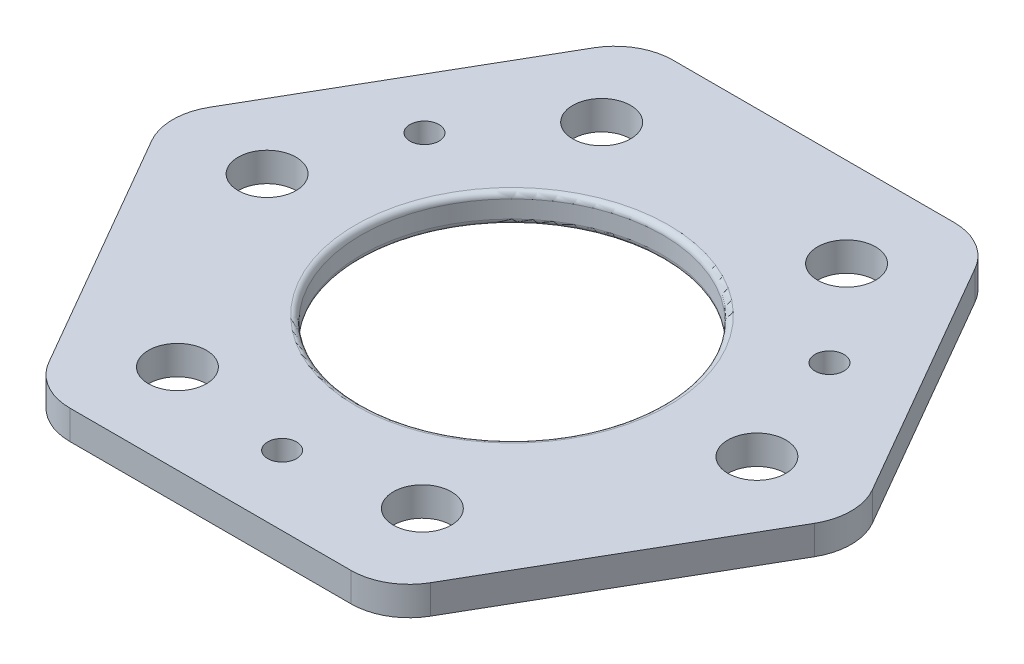
ISO-10303-21;
HEADER;
FILE_DESCRIPTION(('STEP AP214'),'2;1');
FILE_NAME('part.step','',(''),(''),'','','');
FILE_SCHEMA(('AUTOMOTIVE_DESIGN { 1 0 10303 214 1 1 1 1 }'));
ENDSEC;
DATA;
#1=APPLICATION_CONTEXT('core data for automotive mechanical design processes');
#2=APPLICATION_PROTOCOL_DEFINITION('international standard','automotive_design',2000,#1);
#3=PRODUCT_CONTEXT('',#1,'mechanical');
#4=PRODUCT('Part','Part','',(#3));
#5=PRODUCT_RELATED_PRODUCT_CATEGORY('part','',(#4));
#6=PRODUCT_DEFINITION_FORMATION('','',#4);
#7=PRODUCT_DEFINITION_CONTEXT('part definition',#1,'design');
#8=PRODUCT_DEFINITION('design','',#6,#7);
#9=PRODUCT_DEFINITION_SHAPE('','',#8);
#10=(LENGTH_UNIT() NAMED_UNIT(*) SI_UNIT(.MILLI.,.METRE.));
#11=(NAMED_UNIT(*) PLANE_ANGLE_UNIT() SI_UNIT($,.RADIAN.));
#12=(NAMED_UNIT(*) SI_UNIT($,.STERADIAN.) SOLID_ANGLE_UNIT());
#13=UNCERTAINTY_MEASURE_WITH_UNIT(LENGTH_MEASURE(1.E-05),#10,'distance_accuracy_value','');
#14=(GEOMETRIC_REPRESENTATION_CONTEXT(3) GLOBAL_UNCERTAINTY_ASSIGNED_CONTEXT((#13)) GLOBAL_UNIT_ASSIGNED_CONTEXT((#10,
#11,#12)) REPRESENTATION_CONTEXT('',''));
#15=CARTESIAN_POINT('',(0.,0.,0.));
#16=DIRECTION('',(0.,0.,1.));
#17=DIRECTION('',(1.,0.,0.));
#18=AXIS2_PLACEMENT_3D('',#15,#16,#17);
#19=CARTESIAN_POINT('',(-48.4974226119285,5.,3.63424568217141E-13));
#20=DIRECTION('',(0.,-1.,0.));
#21=DIRECTION('',(0.,0.,-1.));
#22=AXIS2_PLACEMENT_3D('',#19,#20,#21);
#23=CYLINDRICAL_SURFACE('',#22,10.);
#24=CARTESIAN_POINT('',(-48.4974226119285,5.,3.63424568217141E-13));
#25=DIRECTION('',(0.,1.,0.));
#26=DIRECTION('',(0.,0.,1.));
#27=AXIS2_PLACEMENT_3D('',#24,#25,#26);
#28=CIRCLE('',#27,10.);
#29=CARTESIAN_POINT('',(-57.157676649773,5.,-4.99999999999955));
#30=VERTEX_POINT('',#29);
#31=CARTESIAN_POINT('',(-57.1576766497729,5.,5.00000000000043));
#32=VERTEX_POINT('',#31);
#33=EDGE_CURVE('E192',#30,#32,#28,.T.);
#34=ORIENTED_EDGE('',*,*,#33,.F.);
#35=DIRECTION('',(0.,-1.,0.));
#36=VECTOR('',#35,1.);
#37=CARTESIAN_POINT('',(-57.157676649773,5.,-4.99999999999957));
#38=LINE('',#37,#36);
#39=CARTESIAN_POINT('',(-57.157676649773,0.,-4.99999999999955));
#40=VERTEX_POINT('',#39);
#41=EDGE_CURVE('E197',#40,#30,#38,.F.);
#42=ORIENTED_EDGE('',*,*,#41,.F.);
#43=CARTESIAN_POINT('',(-48.4974226119285,0.,3.63424568217141E-13));
#44=DIRECTION('',(0.,1.,0.));
#45=DIRECTION('',(0.,0.,1.));
#46=AXIS2_PLACEMENT_3D('',#43,#44,#45);
#47=CIRCLE('',#46,10.);
#48=CARTESIAN_POINT('',(-57.1576766497729,0.,5.00000000000043));
#49=VERTEX_POINT('',#48);
#50=EDGE_CURVE('E183',#49,#40,#47,.F.);
#51=ORIENTED_EDGE('',*,*,#50,.F.);
#52=DIRECTION('',(0.,-1.,0.));
#53=VECTOR('',#52,1.);
#54=CARTESIAN_POINT('',(-57.1576766497729,5.,5.00000000000043));
#55=LINE('',#54,#53);
#56=EDGE_CURVE('E187',#32,#49,#55,.T.);
#57=ORIENTED_EDGE('',*,*,#56,.F.);
#58=EDGE_LOOP('',(#34,#42,#51,#57));
#59=FACE_BOUND('',#58,.T.);
#60=ADVANCED_FACE('F45',(#59),#23,.T.);
#61=CARTESIAN_POINT('',(0.,5.,0.));
#62=DIRECTION('',(0.,1.,0.));
#63=DIRECTION('',(0.,0.,1.));
#64=AXIS2_PLACEMENT_3D('',#61,#62,#63);
#65=PLANE('',#64);
#66=CARTESIAN_POINT('',(0.,5.,0.));
#67=DIRECTION('',(0.,1.,0.));
#68=DIRECTION('',(0.,0.,1.));
#69=AXIS2_PLACEMENT_3D('',#66,#67,#68);
#70=CIRCLE('',#69,26.9999999999999);
#71=CARTESIAN_POINT('',(0.,5.,26.9999999999999));
#72=VERTEX_POINT('',#71);
#73=EDGE_CURVE('E11',#72,#72,#70,.F.);
#74=ORIENTED_EDGE('',*,*,#73,.T.);
#75=EDGE_LOOP('',(#74));
#76=FACE_BOUND('',#75,.T.);
#77=CARTESIAN_POINT('',(-42.2474226119286,5.,-1.49186218934005E-13));
#78=DIRECTION('',(0.,1.,0.));
#79=DIRECTION('',(0.,0.,1.));
#80=AXIS2_PLACEMENT_3D('',#77,#78,#79);
#81=CIRCLE('',#80,5.);
#82=CARTESIAN_POINT('',(-42.2474226119286,5.,4.99999999999985));
#83=VERTEX_POINT('',#82);
#84=EDGE_CURVE('E615',#83,#83,#81,.T.);
#85=ORIENTED_EDGE('',*,*,#84,.F.);
#86=EDGE_LOOP('',(#85));
#87=FACE_BOUND('',#86,.T.);
#88=CARTESIAN_POINT('',(-21.1237113059643,5.,36.5873412263472));
#89=DIRECTION('',(0.,1.,0.));
#90=DIRECTION('',(0.,0.,1.));
#91=AXIS2_PLACEMENT_3D('',#88,#89,#90);
#92=CIRCLE('',#91,4.99999999999999);
#93=CARTESIAN_POINT('',(-21.1237113059643,5.,41.5873412263472));
#94=VERTEX_POINT('',#93);
#95=EDGE_CURVE('E611',#94,#94,#92,.T.);
#96=ORIENTED_EDGE('',*,*,#95,.F.);
#97=EDGE_LOOP('',(#96));
#98=FACE_BOUND('',#97,.T.);
#99=CARTESIAN_POINT('',(21.1237113059643,5.,36.5873412263472));
#100=DIRECTION('',(0.,1.,0.));
#101=DIRECTION('',(0.,0.,1.));
#102=AXIS2_PLACEMENT_3D('',#99,#100,#101);
#103=CIRCLE('',#102,5.);
#104=CARTESIAN_POINT('',(21.1237113059643,5.,41.5873412263472));
#105=VERTEX_POINT('',#104);
#106=EDGE_CURVE('E607',#105,#105,#103,.T.);
#107=ORIENTED_EDGE('',*,*,#106,.F.);
#108=EDGE_LOOP('',(#107));
#109=FACE_BOUND('',#108,.T.);
#110=CARTESIAN_POINT('',(42.2474226119286,5.,-1.56125112837913E-13));
#111=DIRECTION('',(0.,1.,0.));
#112=DIRECTION('',(0.,0.,1.));
#113=AXIS2_PLACEMENT_3D('',#110,#111,#112);
#114=CIRCLE('',#113,5.);
#115=CARTESIAN_POINT('',(42.2474226119286,5.,4.99999999999984));
#116=VERTEX_POINT('',#115);
#117=EDGE_CURVE('E603',#116,#116,#114,.T.);
#118=ORIENTED_EDGE('',*,*,#117,.F.);
#119=EDGE_LOOP('',(#118));
#120=FACE_BOUND('',#119,.T.);
#121=CARTESIAN_POINT('',(21.1237113059641,5.,-36.5873412263474));
#122=DIRECTION('',(0.,1.,0.));
#123=DIRECTION('',(0.,0.,1.));
#124=AXIS2_PLACEMENT_3D('',#121,#122,#123);
#125=CIRCLE('',#124,5.);
#126=CARTESIAN_POINT('',(21.1237113059641,5.,-31.5873412263474));
#127=VERTEX_POINT('',#126);
#128=EDGE_CURVE('E283',#127,#127,#125,.T.);
#129=ORIENTED_EDGE('',*,*,#128,.F.);
#130=EDGE_LOOP('',(#129));
#131=FACE_BOUND('',#130,.T.);
#132=CARTESIAN_POINT('',(-21.1237113059646,5.,-36.5873412263471));
#133=DIRECTION('',(0.,1.,0.));
#134=DIRECTION('',(0.,0.,1.));
#135=AXIS2_PLACEMENT_3D('',#132,#133,#134);
#136=CIRCLE('',#135,5.);
#137=CARTESIAN_POINT('',(-21.1237113059646,5.,-31.5873412263471));
#138=VERTEX_POINT('',#137);
#139=EDGE_CURVE('E279',#138,#138,#136,.T.);
#140=ORIENTED_EDGE('',*,*,#139,.F.);
#141=EDGE_LOOP('',(#140));
#142=FACE_BOUND('',#141,.T.);
#143=CARTESIAN_POINT('',(-24.2487113059646,5.,-41.9999999999998));
#144=DIRECTION('',(0.,1.,0.));
#145=DIRECTION('',(0.,0.,1.));
#146=AXIS2_PLACEMENT_3D('',#143,#144,#145);
#147=CIRCLE('',#146,10.);
#148=CARTESIAN_POINT('',(-24.2487113059647,5.,-51.9999999999998));
#149=VERTEX_POINT('',#148);
#150=CARTESIAN_POINT('',(-32.9089653438091,5.,-46.9999999999997));
#151=VERTEX_POINT('',#150);
#152=EDGE_CURVE('E211',#149,#151,#147,.T.);
#153=ORIENTED_EDGE('',*,*,#152,.T.);
#154=DIRECTION('',(-0.499999999999993,0.,0.866025403784443));
#155=VECTOR('',#154,1.);
#156=CARTESIAN_POINT('',(-30.022213997861,5.,-51.9999999999998));
#157=LINE('',#156,#155);
#158=EDGE_CURVE('E293',#151,#30,#157,.T.);
#159=ORIENTED_EDGE('',*,*,#158,.T.);
#160=ORIENTED_EDGE('',*,*,#33,.T.);
#161=DIRECTION('',(0.500000000000007,0.,0.866025403784435));
#162=VECTOR('',#161,1.);
#163=CARTESIAN_POINT('',(-60.0444279957211,5.,4.57171304468954E-13));
#164=LINE('',#163,#162);
#165=CARTESIAN_POINT('',(-32.9089653438083,5.,47.0000000000002));
#166=VERTEX_POINT('',#165);
#167=EDGE_CURVE('E165',#32,#166,#164,.T.);
#168=ORIENTED_EDGE('',*,*,#167,.T.);
#169=CARTESIAN_POINT('',(-24.248711305964,5.,42.0000000000002));
#170=DIRECTION('',(0.,1.,0.));
#171=DIRECTION('',(0.,0.,1.));
#172=AXIS2_PLACEMENT_3D('',#169,#170,#171);
#173=CIRCLE('',#172,10.);
#174=CARTESIAN_POINT('',(-24.2487113059639,5.,52.0000000000002));
#175=VERTEX_POINT('',#174);
#176=EDGE_CURVE('E194',#166,#175,#173,.T.);
#177=ORIENTED_EDGE('',*,*,#176,.T.);
#178=DIRECTION('',(1.,0.,0.));
#179=VECTOR('',#178,1.);
#180=CARTESIAN_POINT('',(-30.0222139978601,5.,52.0000000000002));
#181=LINE('',#180,#179);
#182=CARTESIAN_POINT('',(24.2487113059647,5.,51.9999999999998));
#183=VERTEX_POINT('',#182);
#184=EDGE_CURVE('E161',#175,#183,#181,.T.);
#185=ORIENTED_EDGE('',*,*,#184,.T.);
#186=CARTESIAN_POINT('',(24.2487113059646,5.,41.9999999999998));
#187=DIRECTION('',(0.,1.,0.));
#188=DIRECTION('',(0.,0.,1.));
#189=AXIS2_PLACEMENT_3D('',#186,#187,#188);
#190=CIRCLE('',#189,10.);
#191=CARTESIAN_POINT('',(32.908965343809,5.,46.9999999999997));
#192=VERTEX_POINT('',#191);
#193=EDGE_CURVE('E174',#183,#192,#190,.T.);
#194=ORIENTED_EDGE('',*,*,#193,.T.);
#195=DIRECTION('',(0.499999999999993,0.,-0.866025403784443));
#196=VECTOR('',#195,1.);
#197=CARTESIAN_POINT('',(30.0222139978609,5.,51.9999999999998));
#198=LINE('',#197,#196);
#199=CARTESIAN_POINT('',(57.157676649773,5.,4.99999999999954));
#200=VERTEX_POINT('',#199);
#201=EDGE_CURVE('E287',#192,#200,#198,.T.);
#202=ORIENTED_EDGE('',*,*,#201,.T.);
#203=CARTESIAN_POINT('',(48.4974226119285,5.,-3.97251675998689E-13));
#204=DIRECTION('',(0.,1.,0.));
#205=DIRECTION('',(0.,0.,1.));
#206=AXIS2_PLACEMENT_3D('',#203,#204,#205);
#207=CIRCLE('',#206,10.);
#208=CARTESIAN_POINT('',(57.1576766497729,5.,-5.00000000000046));
#209=VERTEX_POINT('',#208);
#210=EDGE_CURVE('E176',#200,#209,#207,.T.);
#211=ORIENTED_EDGE('',*,*,#210,.T.);
#212=DIRECTION('',(-0.500000000000007,0.,-0.866025403784435));
#213=VECTOR('',#212,1.);
#214=CARTESIAN_POINT('',(60.044427995721,5.,-4.91343957251438E-13));
#215=LINE('',#214,#213);
#216=CARTESIAN_POINT('',(32.9089653438083,5.,-47.0000000000003));
#217=VERTEX_POINT('',#216);
#218=EDGE_CURVE('E159',#209,#217,#215,.T.);
#219=ORIENTED_EDGE('',*,*,#218,.T.);
#220=CARTESIAN_POINT('',(24.2487113059639,5.,-42.0000000000002));
#221=DIRECTION('',(0.,1.,0.));
#222=DIRECTION('',(0.,0.,1.));
#223=AXIS2_PLACEMENT_3D('',#220,#221,#222);
#224=CIRCLE('',#223,10.);
#225=CARTESIAN_POINT('',(24.2487113059638,5.,-52.0000000000002));
#226=VERTEX_POINT('',#225);
#227=EDGE_CURVE('E209',#217,#226,#224,.T.);
#228=ORIENTED_EDGE('',*,*,#227,.T.);
#229=DIRECTION('',(-1.,0.,0.));
#230=VECTOR('',#229,1.);
#231=CARTESIAN_POINT('',(30.0222139978601,5.,-52.0000000000002));
#232=LINE('',#231,#230);
#233=EDGE_CURVE('E291',#226,#149,#232,.T.);
#234=ORIENTED_EDGE('',*,*,#233,.T.);
#235=EDGE_LOOP('',(#153,#159,#160,#168,#177,#185,#194,#202,#211,#219,#228,#234));
#236=FACE_BOUND('',#235,.T.);
#237=CARTESIAN_POINT('',(34.4691100736159,5.,-20.2896467096704));
#238=DIRECTION('',(0.,1.,0.));
#239=DIRECTION('',(0.,0.,1.));
#240=AXIS2_PLACEMENT_3D('',#237,#238,#239);
#241=CIRCLE('',#240,2.5);
#242=CARTESIAN_POINT('',(34.4691100736159,5.,-17.7896467096704));
#243=VERTEX_POINT('',#242);
#244=EDGE_CURVE('E221',#243,#243,#241,.F.);
#245=ORIENTED_EDGE('',*,*,#244,.T.);
#246=EDGE_LOOP('',(#245));
#247=FACE_BOUND('',#246,.T.);
#248=CARTESIAN_POINT('',(0.336794447577813,5.,39.9959483244287));
#249=DIRECTION('',(0.,1.,0.));
#250=DIRECTION('',(0.,0.,1.));
#251=AXIS2_PLACEMENT_3D('',#248,#249,#250);
#252=CIRCLE('',#251,2.5);
#253=CARTESIAN_POINT('',(0.336794447577813,5.,42.4959483244287));
#254=VERTEX_POINT('',#253);
#255=EDGE_CURVE('E225',#254,#254,#252,.F.);
#256=ORIENTED_EDGE('',*,*,#255,.T.);
#257=EDGE_LOOP('',(#256));
#258=FACE_BOUND('',#257,.T.);
#259=CARTESIAN_POINT('',(-34.805904521194,5.,-19.7063016147581));
#260=DIRECTION('',(0.,1.,0.));
#261=DIRECTION('',(0.,0.,1.));
#262=AXIS2_PLACEMENT_3D('',#259,#260,#261);
#263=CIRCLE('',#262,2.5);
#264=CARTESIAN_POINT('',(-34.805904521194,5.,-17.2063016147581));
#265=VERTEX_POINT('',#264);
#266=EDGE_CURVE('E216',#265,#265,#263,.F.);
#267=ORIENTED_EDGE('',*,*,#266,.T.);
#268=EDGE_LOOP('',(#267));
#269=FACE_BOUND('',#268,.T.);
#270=ADVANCED_FACE('F318',(#76,#87,#98,#109,#120,#131,#142,#236,#247,#258,#269),#65,.T.);
#271=CARTESIAN_POINT('',(-60.0444279957211,5.,4.57171304468954E-13));
#272=DIRECTION('',(0.866025403784435,0.,-0.500000000000007));
#273=DIRECTION('',(-0.500000000000007,0.,-0.866025403784435));
#274=AXIS2_PLACEMENT_3D('',#271,#272,#273);
#275=PLANE('',#274);
#276=DIRECTION('',(0.500000000000007,0.,0.866025403784435));
#277=VECTOR('',#276,1.);
#278=CARTESIAN_POINT('',(-60.0444279957211,0.,4.57171304468954E-13));
#279=LINE('',#278,#277);
#280=CARTESIAN_POINT('',(-32.9089653438083,0.,47.0000000000002));
#281=VERTEX_POINT('',#280);
#282=EDGE_CURVE('E301',#49,#281,#279,.T.);
#283=ORIENTED_EDGE('',*,*,#282,.T.);
#284=DIRECTION('',(0.,-1.,0.));
#285=VECTOR('',#284,1.);
#286=CARTESIAN_POINT('',(-32.9089653438083,5.,47.0000000000002));
#287=LINE('',#286,#285);
#288=EDGE_CURVE('E190',#281,#166,#287,.F.);
#289=ORIENTED_EDGE('',*,*,#288,.T.);
#290=ORIENTED_EDGE('',*,*,#167,.F.);
#291=ORIENTED_EDGE('',*,*,#56,.T.);
#292=EDGE_LOOP('',(#283,#289,#290,#291));
#293=FACE_BOUND('',#292,.T.);
#294=ADVANCED_FACE('F253',(#293),#275,.F.);
#295=CARTESIAN_POINT('',(0.,0.,0.));
#296=DIRECTION('',(0.,1.,0.));
#297=DIRECTION('',(0.,0.,1.));
#298=AXIS2_PLACEMENT_3D('',#295,#296,#297);
#299=PLANE('',#298);
#300=CARTESIAN_POINT('',(0.,0.,0.));
#301=DIRECTION('',(0.,1.,0.));
#302=DIRECTION('',(0.,0.,1.));
#303=AXIS2_PLACEMENT_3D('',#300,#301,#302);
#304=CIRCLE('',#303,26.9999999999999);
#305=CARTESIAN_POINT('',(0.,0.,26.9999999999999));
#306=VERTEX_POINT('',#305);
#307=EDGE_CURVE('E219',#306,#306,#304,.T.);
#308=ORIENTED_EDGE('',*,*,#307,.T.);
#309=EDGE_LOOP('',(#308));
#310=FACE_BOUND('',#309,.T.);
#311=CARTESIAN_POINT('',(-42.2474226119286,0.,-1.49186218934005E-13));
#312=DIRECTION('',(0.,1.,0.));
#313=DIRECTION('',(0.,0.,1.));
#314=AXIS2_PLACEMENT_3D('',#311,#312,#313);
#315=CIRCLE('',#314,5.);
#316=CARTESIAN_POINT('',(-42.2474226119286,0.,4.99999999999985));
#317=VERTEX_POINT('',#316);
#318=EDGE_CURVE('E258',#317,#317,#315,.F.);
#319=ORIENTED_EDGE('',*,*,#318,.F.);
#320=EDGE_LOOP('',(#319));
#321=FACE_BOUND('',#320,.T.);
#322=CARTESIAN_POINT('',(-21.1237113059643,0.,36.5873412263472));
#323=DIRECTION('',(0.,1.,0.));
#324=DIRECTION('',(0.,0.,1.));
#325=AXIS2_PLACEMENT_3D('',#322,#323,#324);
#326=CIRCLE('',#325,4.99999999999999);
#327=CARTESIAN_POINT('',(-21.1237113059643,0.,41.5873412263472));
#328=VERTEX_POINT('',#327);
#329=EDGE_CURVE('E262',#328,#328,#326,.F.);
#330=ORIENTED_EDGE('',*,*,#329,.F.);
#331=EDGE_LOOP('',(#330));
#332=FACE_BOUND('',#331,.T.);
#333=CARTESIAN_POINT('',(21.1237113059643,0.,36.5873412263472));
#334=DIRECTION('',(0.,1.,0.));
#335=DIRECTION('',(0.,0.,1.));
#336=AXIS2_PLACEMENT_3D('',#333,#334,#335);
#337=CIRCLE('',#336,5.);
#338=CARTESIAN_POINT('',(21.1237113059643,0.,41.5873412263472));
#339=VERTEX_POINT('',#338);
#340=EDGE_CURVE('E266',#339,#339,#337,.F.);
#341=ORIENTED_EDGE('',*,*,#340,.F.);
#342=EDGE_LOOP('',(#341));
#343=FACE_BOUND('',#342,.T.);
#344=CARTESIAN_POINT('',(42.2474226119286,0.,-1.56125112837913E-13));
#345=DIRECTION('',(0.,1.,0.));
#346=DIRECTION('',(0.,0.,1.));
#347=AXIS2_PLACEMENT_3D('',#344,#345,#346);
#348=CIRCLE('',#347,5.);
#349=CARTESIAN_POINT('',(42.2474226119286,0.,4.99999999999984));
#350=VERTEX_POINT('',#349);
#351=EDGE_CURVE('E270',#350,#350,#348,.F.);
#352=ORIENTED_EDGE('',*,*,#351,.F.);
#353=EDGE_LOOP('',(#352));
#354=FACE_BOUND('',#353,.T.);
#355=CARTESIAN_POINT('',(21.1237113059641,0.,-36.5873412263474));
#356=DIRECTION('',(0.,1.,0.));
#357=DIRECTION('',(0.,0.,1.));
#358=AXIS2_PLACEMENT_3D('',#355,#356,#357);
#359=CIRCLE('',#358,5.);
#360=CARTESIAN_POINT('',(21.1237113059641,0.,-31.5873412263474));
#361=VERTEX_POINT('',#360);
#362=EDGE_CURVE('E274',#361,#361,#359,.F.);
#363=ORIENTED_EDGE('',*,*,#362,.F.);
#364=EDGE_LOOP('',(#363));
#365=FACE_BOUND('',#364,.T.);
#366=CARTESIAN_POINT('',(-21.1237113059646,0.,-36.5873412263471));
#367=DIRECTION('',(0.,1.,0.));
#368=DIRECTION('',(0.,0.,1.));
#369=AXIS2_PLACEMENT_3D('',#366,#367,#368);
#370=CIRCLE('',#369,5.);
#371=CARTESIAN_POINT('',(-21.1237113059646,0.,-31.5873412263471));
#372=VERTEX_POINT('',#371);
#373=EDGE_CURVE('E277',#372,#372,#370,.F.);
#374=ORIENTED_EDGE('',*,*,#373,.F.);
#375=EDGE_LOOP('',(#374));
#376=FACE_BOUND('',#375,.T.);
#377=DIRECTION('',(-0.499999999999993,0.,0.866025403784443));
#378=VECTOR('',#377,1.);
#379=CARTESIAN_POINT('',(-30.022213997861,0.,-51.9999999999998));
#380=LINE('',#379,#378);
#381=CARTESIAN_POINT('',(-32.9089653438091,0.,-46.9999999999997));
#382=VERTEX_POINT('',#381);
#383=EDGE_CURVE('E299',#382,#40,#380,.T.);
#384=ORIENTED_EDGE('',*,*,#383,.F.);
#385=CARTESIAN_POINT('',(-24.2487113059646,0.,-41.9999999999998));
#386=DIRECTION('',(0.,1.,0.));
#387=DIRECTION('',(0.,0.,1.));
#388=AXIS2_PLACEMENT_3D('',#385,#386,#387);
#389=CIRCLE('',#388,10.);
#390=CARTESIAN_POINT('',(-24.2487113059647,0.,-51.9999999999998));
#391=VERTEX_POINT('',#390);
#392=EDGE_CURVE('E203',#382,#391,#389,.F.);
#393=ORIENTED_EDGE('',*,*,#392,.T.);
#394=DIRECTION('',(-1.,0.,0.));
#395=VECTOR('',#394,1.);
#396=CARTESIAN_POINT('',(30.0222139978601,0.,-52.0000000000002));
#397=LINE('',#396,#395);
#398=CARTESIAN_POINT('',(24.2487113059638,0.,-52.0000000000002));
#399=VERTEX_POINT('',#398);
#400=EDGE_CURVE('E145',#399,#391,#397,.T.);
#401=ORIENTED_EDGE('',*,*,#400,.F.);
#402=CARTESIAN_POINT('',(24.2487113059639,0.,-42.0000000000002));
#403=DIRECTION('',(0.,1.,0.));
#404=DIRECTION('',(0.,0.,1.));
#405=AXIS2_PLACEMENT_3D('',#402,#403,#404);
#406=CIRCLE('',#405,10.);
#407=CARTESIAN_POINT('',(32.9089653438083,0.,-47.0000000000003));
#408=VERTEX_POINT('',#407);
#409=EDGE_CURVE('E143',#399,#408,#406,.F.);
#410=ORIENTED_EDGE('',*,*,#409,.T.);
#411=DIRECTION('',(-0.500000000000007,0.,-0.866025403784435));
#412=VECTOR('',#411,1.);
#413=CARTESIAN_POINT('',(60.044427995721,0.,-4.91343957251438E-13));
#414=LINE('',#413,#412);
#415=CARTESIAN_POINT('',(57.1576766497729,0.,-5.00000000000046));
#416=VERTEX_POINT('',#415);
#417=EDGE_CURVE('E135',#416,#408,#414,.T.);
#418=ORIENTED_EDGE('',*,*,#417,.F.);
#419=CARTESIAN_POINT('',(48.4974226119285,0.,-3.97251675998689E-13));
#420=DIRECTION('',(0.,1.,0.));
#421=DIRECTION('',(0.,0.,1.));
#422=AXIS2_PLACEMENT_3D('',#419,#420,#421);
#423=CIRCLE('',#422,10.);
#424=CARTESIAN_POINT('',(57.157676649773,0.,4.99999999999954));
#425=VERTEX_POINT('',#424);
#426=EDGE_CURVE('E140',#416,#425,#423,.F.);
#427=ORIENTED_EDGE('',*,*,#426,.T.);
#428=DIRECTION('',(0.499999999999993,0.,-0.866025403784443));
#429=VECTOR('',#428,1.);
#430=CARTESIAN_POINT('',(30.0222139978609,0.,51.9999999999998));
#431=LINE('',#430,#429);
#432=CARTESIAN_POINT('',(32.908965343809,0.,46.9999999999997));
#433=VERTEX_POINT('',#432);
#434=EDGE_CURVE('E146',#433,#425,#431,.T.);
#435=ORIENTED_EDGE('',*,*,#434,.F.);
#436=CARTESIAN_POINT('',(24.2487113059646,0.,41.9999999999998));
#437=DIRECTION('',(0.,1.,0.));
#438=DIRECTION('',(0.,0.,1.));
#439=AXIS2_PLACEMENT_3D('',#436,#437,#438);
#440=CIRCLE('',#439,10.);
#441=CARTESIAN_POINT('',(24.2487113059647,0.,51.9999999999998));
#442=VERTEX_POINT('',#441);
#443=EDGE_CURVE('E156',#433,#442,#440,.F.);
#444=ORIENTED_EDGE('',*,*,#443,.T.);
#445=DIRECTION('',(1.,0.,0.));
#446=VECTOR('',#445,1.);
#447=CARTESIAN_POINT('',(-30.0222139978601,0.,52.0000000000002));
#448=LINE('',#447,#446);
#449=CARTESIAN_POINT('',(-24.2487113059639,0.,52.0000000000002));
#450=VERTEX_POINT('',#449);
#451=EDGE_CURVE('E168',#450,#442,#448,.T.);
#452=ORIENTED_EDGE('',*,*,#451,.F.);
#453=CARTESIAN_POINT('',(-24.248711305964,0.,42.0000000000002));
#454=DIRECTION('',(0.,1.,0.));
#455=DIRECTION('',(0.,0.,1.));
#456=AXIS2_PLACEMENT_3D('',#453,#454,#455);
#457=CIRCLE('',#456,10.);
#458=EDGE_CURVE('E185',#450,#281,#457,.F.);
#459=ORIENTED_EDGE('',*,*,#458,.T.);
#460=ORIENTED_EDGE('',*,*,#282,.F.);
#461=ORIENTED_EDGE('',*,*,#50,.T.);
#462=EDGE_LOOP('',(#384,#393,#401,#410,#418,#427,#435,#444,#452,#459,#460,#461));
#463=FACE_BOUND('',#462,.T.);
#464=CARTESIAN_POINT('',(0.336794447577813,0.,39.9959483244287));
#465=DIRECTION('',(0.,-1.,0.));
#466=DIRECTION('',(0.,0.,-1.));
#467=AXIS2_PLACEMENT_3D('',#464,#465,#466);
#468=CIRCLE('',#467,2.5);
#469=CARTESIAN_POINT('',(0.336794447577813,0.,37.4959483244287));
#470=VERTEX_POINT('',#469);
#471=EDGE_CURVE('E215',#470,#470,#468,.F.);
#472=ORIENTED_EDGE('',*,*,#471,.T.);
#473=EDGE_LOOP('',(#472));
#474=FACE_BOUND('',#473,.T.);
#475=CARTESIAN_POINT('',(34.4691100736159,0.,-20.2896467096704));
#476=DIRECTION('',(0.,-1.,0.));
#477=DIRECTION('',(0.,0.,-1.));
#478=AXIS2_PLACEMENT_3D('',#475,#476,#477);
#479=CIRCLE('',#478,2.5);
#480=CARTESIAN_POINT('',(34.4691100736159,0.,-22.7896467096704));
#481=VERTEX_POINT('',#480);
#482=EDGE_CURVE('E224',#481,#481,#479,.F.);
#483=ORIENTED_EDGE('',*,*,#482,.T.);
#484=EDGE_LOOP('',(#483));
#485=FACE_BOUND('',#484,.T.);
#486=CARTESIAN_POINT('',(-34.805904521194,0.,-19.7063016147581));
#487=DIRECTION('',(0.,-1.,0.));
#488=DIRECTION('',(0.,0.,-1.));
#489=AXIS2_PLACEMENT_3D('',#486,#487,#488);
#490=CIRCLE('',#489,2.5);
#491=CARTESIAN_POINT('',(-34.805904521194,0.,-22.2063016147581));
#492=VERTEX_POINT('',#491);
#493=EDGE_CURVE('E220',#492,#492,#490,.F.);
#494=ORIENTED_EDGE('',*,*,#493,.T.);
#495=EDGE_LOOP('',(#494));
#496=FACE_BOUND('',#495,.T.);
#497=ADVANCED_FACE('F137',(#310,#321,#332,#343,#354,#365,#376,#463,#474,#485,#496),#299,.F.);
#498=CARTESIAN_POINT('',(-24.248711305964,5.,42.0000000000002));
#499=DIRECTION('',(0.,-1.,0.));
#500=DIRECTION('',(0.,0.,-1.));
#501=AXIS2_PLACEMENT_3D('',#498,#499,#500);
#502=CYLINDRICAL_SURFACE('',#501,10.);
#503=ORIENTED_EDGE('',*,*,#176,.F.);
#504=ORIENTED_EDGE('',*,*,#288,.F.);
#505=ORIENTED_EDGE('',*,*,#458,.F.);
#506=DIRECTION('',(0.,-1.,0.));
#507=VECTOR('',#506,1.);
#508=CARTESIAN_POINT('',(-24.2487113059639,5.,52.0000000000002));
#509=LINE('',#508,#507);
#510=EDGE_CURVE('E180',#175,#450,#509,.T.);
#511=ORIENTED_EDGE('',*,*,#510,.F.);
#512=EDGE_LOOP('',(#503,#504,#505,#511));
#513=FACE_BOUND('',#512,.T.);
#514=ADVANCED_FACE('F252',(#513),#502,.T.);
#515=CARTESIAN_POINT('',(24.2487113059639,5.,-42.0000000000002));
#516=DIRECTION('',(0.,-1.,0.));
#517=DIRECTION('',(0.,0.,-1.));
#518=AXIS2_PLACEMENT_3D('',#515,#516,#517);
#519=CYLINDRICAL_SURFACE('',#518,10.);
#520=ORIENTED_EDGE('',*,*,#227,.F.);
#521=DIRECTION('',(0.,-1.,0.));
#522=VECTOR('',#521,1.);
#523=CARTESIAN_POINT('',(32.9089653438083,5.,-47.0000000000003));
#524=LINE('',#523,#522);
#525=EDGE_CURVE('E60',#408,#217,#524,.F.);
#526=ORIENTED_EDGE('',*,*,#525,.F.);
#527=ORIENTED_EDGE('',*,*,#409,.F.);
#528=DIRECTION('',(0.,-1.,0.));
#529=VECTOR('',#528,1.);
#530=CARTESIAN_POINT('',(24.2487113059638,5.,-52.0000000000002));
#531=LINE('',#530,#529);
#532=EDGE_CURVE('E205',#226,#399,#531,.T.);
#533=ORIENTED_EDGE('',*,*,#532,.F.);
#534=EDGE_LOOP('',(#520,#526,#527,#533));
#535=FACE_BOUND('',#534,.T.);
#536=ADVANCED_FACE('F359',(#535),#519,.T.);
#537=CARTESIAN_POINT('',(30.0222139978601,5.,-52.0000000000002));
#538=DIRECTION('',(0.,0.,1.));
#539=DIRECTION('',(1.,0.,0.));
#540=AXIS2_PLACEMENT_3D('',#537,#538,#539);
#541=PLANE('',#540);
#542=ORIENTED_EDGE('',*,*,#400,.T.);
#543=DIRECTION('',(0.,-1.,0.));
#544=VECTOR('',#543,1.);
#545=CARTESIAN_POINT('',(-24.2487113059647,5.,-51.9999999999998));
#546=LINE('',#545,#544);
#547=EDGE_CURVE('E68',#391,#149,#546,.F.);
#548=ORIENTED_EDGE('',*,*,#547,.T.);
#549=ORIENTED_EDGE('',*,*,#233,.F.);
#550=ORIENTED_EDGE('',*,*,#532,.T.);
#551=EDGE_LOOP('',(#542,#548,#549,#550));
#552=FACE_BOUND('',#551,.T.);
#553=ADVANCED_FACE('F369',(#552),#541,.F.);
#554=CARTESIAN_POINT('',(-24.2487113059646,5.,-41.9999999999998));
#555=DIRECTION('',(0.,-1.,0.));
#556=DIRECTION('',(0.,0.,-1.));
#557=AXIS2_PLACEMENT_3D('',#554,#555,#556);
#558=CYLINDRICAL_SURFACE('',#557,10.);
#559=ORIENTED_EDGE('',*,*,#152,.F.);
#560=ORIENTED_EDGE('',*,*,#547,.F.);
#561=ORIENTED_EDGE('',*,*,#392,.F.);
#562=DIRECTION('',(0.,-1.,0.));
#563=VECTOR('',#562,1.);
#564=CARTESIAN_POINT('',(-32.9089653438091,5.,-46.9999999999997));
#565=LINE('',#564,#563);
#566=EDGE_CURVE('E199',#151,#382,#565,.T.);
#567=ORIENTED_EDGE('',*,*,#566,.F.);
#568=EDGE_LOOP('',(#559,#560,#561,#567));
#569=FACE_BOUND('',#568,.T.);
#570=ADVANCED_FACE('F367',(#569),#558,.T.);
#571=CARTESIAN_POINT('',(-30.022213997861,5.,-51.9999999999998));
#572=DIRECTION('',(0.866025403784443,0.,0.499999999999993));
#573=DIRECTION('',(0.499999999999993,0.,-0.866025403784443));
#574=AXIS2_PLACEMENT_3D('',#571,#572,#573);
#575=PLANE('',#574);
#576=ORIENTED_EDGE('',*,*,#158,.F.);
#577=ORIENTED_EDGE('',*,*,#566,.T.);
#578=ORIENTED_EDGE('',*,*,#383,.T.);
#579=ORIENTED_EDGE('',*,*,#41,.T.);
#580=EDGE_LOOP('',(#576,#577,#578,#579));
#581=FACE_BOUND('',#580,.T.);
#582=ADVANCED_FACE('F331',(#581),#575,.F.);
#583=CARTESIAN_POINT('',(24.2487113059646,5.,41.9999999999998));
#584=DIRECTION('',(0.,-1.,0.));
#585=DIRECTION('',(0.,0.,-1.));
#586=AXIS2_PLACEMENT_3D('',#583,#584,#585);
#587=CYLINDRICAL_SURFACE('',#586,10.);
#588=ORIENTED_EDGE('',*,*,#193,.F.);
#589=DIRECTION('',(0.,-1.,0.));
#590=VECTOR('',#589,1.);
#591=CARTESIAN_POINT('',(24.2487113059647,5.,51.9999999999998));
#592=LINE('',#591,#590);
#593=EDGE_CURVE('E178',#442,#183,#592,.F.);
#594=ORIENTED_EDGE('',*,*,#593,.F.);
#595=ORIENTED_EDGE('',*,*,#443,.F.);
#596=DIRECTION('',(0.,-1.,0.));
#597=VECTOR('',#596,1.);
#598=CARTESIAN_POINT('',(32.908965343809,5.,46.9999999999997));
#599=LINE('',#598,#597);
#600=EDGE_CURVE('E155',#192,#433,#599,.T.);
#601=ORIENTED_EDGE('',*,*,#600,.F.);
#602=EDGE_LOOP('',(#588,#594,#595,#601));
#603=FACE_BOUND('',#602,.T.);
#604=ADVANCED_FACE('F314',(#603),#587,.T.);
#605=CARTESIAN_POINT('',(30.0222139978609,5.,51.9999999999998));
#606=DIRECTION('',(-0.866025403784443,0.,-0.499999999999993));
#607=DIRECTION('',(-0.499999999999993,0.,0.866025403784443));
#608=AXIS2_PLACEMENT_3D('',#605,#606,#607);
#609=PLANE('',#608);
#610=ORIENTED_EDGE('',*,*,#434,.T.);
#611=DIRECTION('',(0.,-1.,0.));
#612=VECTOR('',#611,1.);
#613=CARTESIAN_POINT('',(57.157676649773,5.,4.99999999999953));
#614=LINE('',#613,#612);
#615=EDGE_CURVE('E154',#425,#200,#614,.F.);
#616=ORIENTED_EDGE('',*,*,#615,.T.);
#617=ORIENTED_EDGE('',*,*,#201,.F.);
#618=ORIENTED_EDGE('',*,*,#600,.T.);
#619=EDGE_LOOP('',(#610,#616,#617,#618));
#620=FACE_BOUND('',#619,.T.);
#621=ADVANCED_FACE('F321',(#620),#609,.F.);
#622=CARTESIAN_POINT('',(-30.0222139978601,5.,52.0000000000002));
#623=DIRECTION('',(0.,0.,-1.));
#624=DIRECTION('',(-1.,0.,0.));
#625=AXIS2_PLACEMENT_3D('',#622,#623,#624);
#626=PLANE('',#625);
#627=ORIENTED_EDGE('',*,*,#451,.T.);
#628=ORIENTED_EDGE('',*,*,#593,.T.);
#629=ORIENTED_EDGE('',*,*,#184,.F.);
#630=ORIENTED_EDGE('',*,*,#510,.T.);
#631=EDGE_LOOP('',(#627,#628,#629,#630));
#632=FACE_BOUND('',#631,.T.);
#633=ADVANCED_FACE('F309',(#632),#626,.F.);
#634=CARTESIAN_POINT('',(48.4974226119285,5.,-3.97251675998689E-13));
#635=DIRECTION('',(0.,-1.,0.));
#636=DIRECTION('',(0.,0.,-1.));
#637=AXIS2_PLACEMENT_3D('',#634,#635,#636);
#638=CYLINDRICAL_SURFACE('',#637,10.);
#639=ORIENTED_EDGE('',*,*,#210,.F.);
#640=ORIENTED_EDGE('',*,*,#615,.F.);
#641=ORIENTED_EDGE('',*,*,#426,.F.);
#642=DIRECTION('',(0.,-1.,0.));
#643=VECTOR('',#642,1.);
#644=CARTESIAN_POINT('',(57.1576766497729,5.,-5.00000000000047));
#645=LINE('',#644,#643);
#646=EDGE_CURVE('E153',#209,#416,#645,.T.);
#647=ORIENTED_EDGE('',*,*,#646,.F.);
#648=EDGE_LOOP('',(#639,#640,#641,#647));
#649=FACE_BOUND('',#648,.T.);
#650=ADVANCED_FACE('F152',(#649),#638,.T.);
#651=CARTESIAN_POINT('',(60.044427995721,5.,-4.91343957251438E-13));
#652=DIRECTION('',(-0.866025403784435,0.,0.500000000000007));
#653=DIRECTION('',(0.500000000000007,0.,0.866025403784435));
#654=AXIS2_PLACEMENT_3D('',#651,#652,#653);
#655=PLANE('',#654);
#656=ORIENTED_EDGE('',*,*,#218,.F.);
#657=ORIENTED_EDGE('',*,*,#646,.T.);
#658=ORIENTED_EDGE('',*,*,#417,.T.);
#659=ORIENTED_EDGE('',*,*,#525,.T.);
#660=EDGE_LOOP('',(#656,#657,#658,#659));
#661=FACE_BOUND('',#660,.T.);
#662=ADVANCED_FACE('F158',(#661),#655,.F.);
#663=CARTESIAN_POINT('',(0.,-15.,0.));
#664=DIRECTION('',(0.,1.,0.));
#665=DIRECTION('',(0.,0.,1.));
#666=AXIS2_PLACEMENT_3D('',#663,#664,#665);
#667=CYLINDRICAL_SURFACE('',#666,25.9999999999999);
#668=CARTESIAN_POINT('',(0.,1.,0.));
#669=DIRECTION('',(0.,1.,0.));
#670=DIRECTION('',(0.,0.,1.));
#671=AXIS2_PLACEMENT_3D('',#668,#669,#670);
#672=CIRCLE('',#671,25.9999999999999);
#673=CARTESIAN_POINT('',(0.,1.,25.9999999999999));
#674=VERTEX_POINT('',#673);
#675=EDGE_CURVE('E53',#674,#674,#672,.F.);
#676=ORIENTED_EDGE('',*,*,#675,.T.);
#677=EDGE_LOOP('',(#676));
#678=FACE_BOUND('',#677,.T.);
#679=CARTESIAN_POINT('',(0.,4.,0.));
#680=DIRECTION('',(0.,1.,0.));
#681=DIRECTION('',(0.,0.,1.));
#682=AXIS2_PLACEMENT_3D('',#679,#680,#681);
#683=CIRCLE('',#682,25.9999999999999);
#684=CARTESIAN_POINT('',(0.,4.,25.9999999999999));
#685=VERTEX_POINT('',#684);
#686=EDGE_CURVE('E236',#685,#685,#683,.T.);
#687=ORIENTED_EDGE('',*,*,#686,.T.);
#688=EDGE_LOOP('',(#687));
#689=FACE_BOUND('',#688,.T.);
#690=ADVANCED_FACE('F241',(#678,#689),#667,.F.);
#691=CARTESIAN_POINT('',(-34.805904521194,-12.5,-19.7063016147581));
#692=DIRECTION('',(0.,1.,0.));
#693=DIRECTION('',(0.,0.,1.));
#694=AXIS2_PLACEMENT_3D('',#691,#692,#693);
#695=CYLINDRICAL_SURFACE('',#694,2.5);
#696=ORIENTED_EDGE('',*,*,#266,.F.);
#697=EDGE_LOOP('',(#696));
#698=FACE_BOUND('',#697,.T.);
#699=ORIENTED_EDGE('',*,*,#493,.F.);
#700=EDGE_LOOP('',(#699));
#701=FACE_BOUND('',#700,.T.);
#702=ADVANCED_FACE('F348',(#698,#701),#695,.F.);
#703=CARTESIAN_POINT('',(34.4691100736159,-12.5,-20.2896467096704));
#704=DIRECTION('',(0.,1.,0.));
#705=DIRECTION('',(0.,0.,1.));
#706=AXIS2_PLACEMENT_3D('',#703,#704,#705);
#707=CYLINDRICAL_SURFACE('',#706,2.5);
#708=ORIENTED_EDGE('',*,*,#244,.F.);
#709=EDGE_LOOP('',(#708));
#710=FACE_BOUND('',#709,.T.);
#711=ORIENTED_EDGE('',*,*,#482,.F.);
#712=EDGE_LOOP('',(#711));
#713=FACE_BOUND('',#712,.T.);
#714=ADVANCED_FACE('F338',(#710,#713),#707,.F.);
#715=CARTESIAN_POINT('',(0.336794447577813,-12.5,39.9959483244287));
#716=DIRECTION('',(0.,1.,0.));
#717=DIRECTION('',(0.,0.,1.));
#718=AXIS2_PLACEMENT_3D('',#715,#716,#717);
#719=CYLINDRICAL_SURFACE('',#718,2.5);
#720=ORIENTED_EDGE('',*,*,#255,.F.);
#721=EDGE_LOOP('',(#720));
#722=FACE_BOUND('',#721,.T.);
#723=ORIENTED_EDGE('',*,*,#471,.F.);
#724=EDGE_LOOP('',(#723));
#725=FACE_BOUND('',#724,.T.);
#726=ADVANCED_FACE('F336',(#722,#725),#719,.F.);
#727=CARTESIAN_POINT('',(-21.1237113059646,-14.1421356237309,-36.5873412263471));
#728=DIRECTION('',(0.,1.,0.));
#729=DIRECTION('',(0.,0.,1.));
#730=AXIS2_PLACEMENT_3D('',#727,#728,#729);
#731=CYLINDRICAL_SURFACE('',#730,5.);
#732=ORIENTED_EDGE('',*,*,#373,.T.);
#733=EDGE_LOOP('',(#732));
#734=FACE_BOUND('',#733,.T.);
#735=ORIENTED_EDGE('',*,*,#139,.T.);
#736=EDGE_LOOP('',(#735));
#737=FACE_BOUND('',#736,.T.);
#738=ADVANCED_FACE('F333',(#734,#737),#731,.F.);
#739=CARTESIAN_POINT('',(21.1237113059641,-14.1421356237309,-36.5873412263474));
#740=DIRECTION('',(0.,1.,0.));
#741=DIRECTION('',(0.,0.,1.));
#742=AXIS2_PLACEMENT_3D('',#739,#740,#741);
#743=CYLINDRICAL_SURFACE('',#742,5.);
#744=ORIENTED_EDGE('',*,*,#362,.T.);
#745=EDGE_LOOP('',(#744));
#746=FACE_BOUND('',#745,.T.);
#747=ORIENTED_EDGE('',*,*,#128,.T.);
#748=EDGE_LOOP('',(#747));
#749=FACE_BOUND('',#748,.T.);
#750=ADVANCED_FACE('F346',(#746,#749),#743,.F.);
#751=CARTESIAN_POINT('',(42.2474226119286,-14.1421356237309,-1.56125112837913E-13));
#752=DIRECTION('',(0.,1.,0.));
#753=DIRECTION('',(0.,0.,1.));
#754=AXIS2_PLACEMENT_3D('',#751,#752,#753);
#755=CYLINDRICAL_SURFACE('',#754,5.);
#756=ORIENTED_EDGE('',*,*,#351,.T.);
#757=EDGE_LOOP('',(#756));
#758=FACE_BOUND('',#757,.T.);
#759=ORIENTED_EDGE('',*,*,#117,.T.);
#760=EDGE_LOOP('',(#759));
#761=FACE_BOUND('',#760,.T.);
#762=ADVANCED_FACE('F573',(#758,#761),#755,.F.);
#763=CARTESIAN_POINT('',(21.1237113059643,-14.1421356237309,36.5873412263472));
#764=DIRECTION('',(0.,1.,0.));
#765=DIRECTION('',(0.,0.,1.));
#766=AXIS2_PLACEMENT_3D('',#763,#764,#765);
#767=CYLINDRICAL_SURFACE('',#766,5.);
#768=ORIENTED_EDGE('',*,*,#340,.T.);
#769=EDGE_LOOP('',(#768));
#770=FACE_BOUND('',#769,.T.);
#771=ORIENTED_EDGE('',*,*,#106,.T.);
#772=EDGE_LOOP('',(#771));
#773=FACE_BOUND('',#772,.T.);
#774=ADVANCED_FACE('F563',(#770,#773),#767,.F.);
#775=CARTESIAN_POINT('',(-21.1237113059643,-14.1421356237309,36.5873412263472));
#776=DIRECTION('',(0.,1.,0.));
#777=DIRECTION('',(0.,0.,1.));
#778=AXIS2_PLACEMENT_3D('',#775,#776,#777);
#779=CYLINDRICAL_SURFACE('',#778,4.99999999999999);
#780=ORIENTED_EDGE('',*,*,#329,.T.);
#781=EDGE_LOOP('',(#780));
#782=FACE_BOUND('',#781,.T.);
#783=ORIENTED_EDGE('',*,*,#95,.T.);
#784=EDGE_LOOP('',(#783));
#785=FACE_BOUND('',#784,.T.);
#786=ADVANCED_FACE('F553',(#782,#785),#779,.F.);
#787=CARTESIAN_POINT('',(-42.2474226119286,-14.1421356237309,-1.49186218934005E-13));
#788=DIRECTION('',(0.,1.,0.));
#789=DIRECTION('',(0.,0.,1.));
#790=AXIS2_PLACEMENT_3D('',#787,#788,#789);
#791=CYLINDRICAL_SURFACE('',#790,5.);
#792=ORIENTED_EDGE('',*,*,#318,.T.);
#793=EDGE_LOOP('',(#792));
#794=FACE_BOUND('',#793,.T.);
#795=ORIENTED_EDGE('',*,*,#84,.T.);
#796=EDGE_LOOP('',(#795));
#797=FACE_BOUND('',#796,.T.);
#798=ADVANCED_FACE('F247',(#794,#797),#791,.F.);
#799=CARTESIAN_POINT('',(0.,1.,0.));
#800=DIRECTION('',(0.,1.,0.));
#801=DIRECTION('',(0.,0.,1.));
#802=AXIS2_PLACEMENT_3D('',#799,#800,#801);
#803=TOROIDAL_SURFACE('',#802,26.9999999999999,1.);
#804=ORIENTED_EDGE('',*,*,#675,.F.);
#805=EDGE_LOOP('',(#804));
#806=FACE_BOUND('',#805,.T.);
#807=ORIENTED_EDGE('',*,*,#307,.F.);
#808=EDGE_LOOP('',(#807));
#809=FACE_BOUND('',#808,.T.);
#810=ADVANCED_FACE('F244',(#806,#809),#803,.T.);
#811=CARTESIAN_POINT('',(0.,4.,0.));
#812=DIRECTION('',(0.,1.,0.));
#813=DIRECTION('',(0.,0.,1.));
#814=AXIS2_PLACEMENT_3D('',#811,#812,#813);
#815=TOROIDAL_SURFACE('',#814,26.9999999999999,1.);
#816=ORIENTED_EDGE('',*,*,#73,.F.);
#817=EDGE_LOOP('',(#816));
#818=FACE_BOUND('',#817,.T.);
#819=ORIENTED_EDGE('',*,*,#686,.F.);
#820=EDGE_LOOP('',(#819));
#821=FACE_BOUND('',#820,.T.);
#822=ADVANCED_FACE('F47',(#818,#821),#815,.T.);
#823=CLOSED_SHELL('',(#60,#270,#294,#497,#514,#536,#553,#570,#582,#604,#621,#633,#650,#662,#690,
#702,#714,#726,#738,#750,#762,#774,#786,#798,#810,#822));
#824=MANIFOLD_SOLID_BREP('B2',#823);
#825=ADVANCED_BREP_SHAPE_REPRESENTATION('',(#18,#824),#14);
#826=SHAPE_DEFINITION_REPRESENTATION(#9,#825);
ENDSEC;
END-ISO-10303-21;
